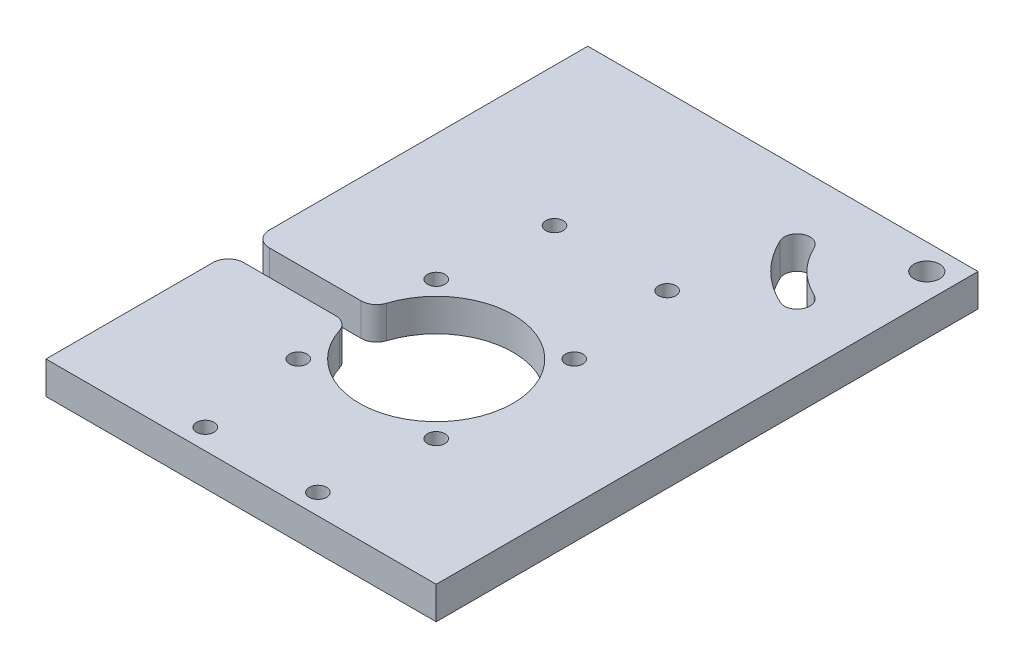
ISO-10303-21;
HEADER;
FILE_DESCRIPTION(('STEP AP214'),'2;1');
FILE_NAME('part.step','',(''),(''),'','','');
FILE_SCHEMA(('AUTOMOTIVE_DESIGN { 1 0 10303 214 1 1 1 1 }'));
ENDSEC;
DATA;
#1=APPLICATION_CONTEXT('core data for automotive mechanical design processes');
#2=APPLICATION_PROTOCOL_DEFINITION('international standard','automotive_design',2000,#1);
#3=PRODUCT_CONTEXT('',#1,'mechanical');
#4=PRODUCT('Part','Part','',(#3));
#5=PRODUCT_RELATED_PRODUCT_CATEGORY('part','',(#4));
#6=PRODUCT_DEFINITION_FORMATION('','',#4);
#7=PRODUCT_DEFINITION_CONTEXT('part definition',#1,'design');
#8=PRODUCT_DEFINITION('design','',#6,#7);
#9=PRODUCT_DEFINITION_SHAPE('','',#8);
#10=(LENGTH_UNIT() NAMED_UNIT(*) SI_UNIT(.MILLI.,.METRE.));
#11=(NAMED_UNIT(*) PLANE_ANGLE_UNIT() SI_UNIT($,.RADIAN.));
#12=(NAMED_UNIT(*) SI_UNIT($,.STERADIAN.) SOLID_ANGLE_UNIT());
#13=UNCERTAINTY_MEASURE_WITH_UNIT(LENGTH_MEASURE(1.E-05),#10,'distance_accuracy_value','');
#14=(GEOMETRIC_REPRESENTATION_CONTEXT(3) GLOBAL_UNCERTAINTY_ASSIGNED_CONTEXT((#13)) GLOBAL_UNIT_ASSIGNED_CONTEXT((#10,
#11,#12)) REPRESENTATION_CONTEXT('',''));
#15=CARTESIAN_POINT('',(0.,0.,0.));
#16=DIRECTION('',(0.,0.,1.));
#17=DIRECTION('',(1.,0.,0.));
#18=AXIS2_PLACEMENT_3D('',#15,#16,#17);
#19=CARTESIAN_POINT('',(0.,6.35,0.));
#20=DIRECTION('',(0.,-1.,0.));
#21=DIRECTION('',(0.,0.,-1.));
#22=AXIS2_PLACEMENT_3D('',#19,#20,#21);
#23=PLANE('',#22);
#24=CARTESIAN_POINT('',(-11.,6.35,34.1));
#25=DIRECTION('',(0.,1.,0.));
#26=DIRECTION('',(0.,0.,1.));
#27=AXIS2_PLACEMENT_3D('',#24,#25,#26);
#28=CIRCLE('',#27,1.69999999999999);
#29=CARTESIAN_POINT('',(-11.,6.35,35.8));
#30=VERTEX_POINT('',#29);
#31=EDGE_CURVE('E617',#30,#30,#28,.T.);
#32=ORIENTED_EDGE('',*,*,#31,.F.);
#33=EDGE_LOOP('',(#32));
#34=FACE_BOUND('',#33,.T.);
#35=CARTESIAN_POINT('',(11.,6.35,34.1));
#36=DIRECTION('',(0.,1.,0.));
#37=DIRECTION('',(0.,0.,1.));
#38=AXIS2_PLACEMENT_3D('',#35,#36,#37);
#39=CIRCLE('',#38,1.69999999999999);
#40=CARTESIAN_POINT('',(11.,6.35,35.8));
#41=VERTEX_POINT('',#40);
#42=EDGE_CURVE('E608',#41,#41,#39,.T.);
#43=ORIENTED_EDGE('',*,*,#42,.F.);
#44=EDGE_LOOP('',(#43));
#45=FACE_BOUND('',#44,.T.);
#46=CARTESIAN_POINT('',(-11.,6.35,-34.1));
#47=DIRECTION('',(0.,1.,0.));
#48=DIRECTION('',(0.,0.,1.));
#49=AXIS2_PLACEMENT_3D('',#46,#47,#48);
#50=CIRCLE('',#49,1.69999999999999);
#51=CARTESIAN_POINT('',(-11.,6.35,-32.4));
#52=VERTEX_POINT('',#51);
#53=EDGE_CURVE('E614',#52,#52,#50,.T.);
#54=ORIENTED_EDGE('',*,*,#53,.F.);
#55=EDGE_LOOP('',(#54));
#56=FACE_BOUND('',#55,.T.);
#57=CARTESIAN_POINT('',(11.,6.35,-34.1));
#58=DIRECTION('',(0.,1.,0.));
#59=DIRECTION('',(0.,0.,1.));
#60=AXIS2_PLACEMENT_3D('',#57,#58,#59);
#61=CIRCLE('',#60,1.69999999999999);
#62=CARTESIAN_POINT('',(11.,6.35,-32.4));
#63=VERTEX_POINT('',#62);
#64=EDGE_CURVE('E627',#63,#63,#61,.T.);
#65=ORIENTED_EDGE('',*,*,#64,.F.);
#66=EDGE_LOOP('',(#65));
#67=FACE_BOUND('',#66,.T.);
#68=CARTESIAN_POINT('',(-13.4703841816038,6.35,-13.4703841816037));
#69=DIRECTION('',(0.,1.,0.));
#70=DIRECTION('',(0.,0.,1.));
#71=AXIS2_PLACEMENT_3D('',#68,#69,#70);
#72=CIRCLE('',#71,1.69999999999999);
#73=CARTESIAN_POINT('',(-13.4703841816038,6.35,-11.7703841816037));
#74=VERTEX_POINT('',#73);
#75=EDGE_CURVE('E647',#74,#74,#72,.T.);
#76=ORIENTED_EDGE('',*,*,#75,.F.);
#77=EDGE_LOOP('',(#76));
#78=FACE_BOUND('',#77,.T.);
#79=CARTESIAN_POINT('',(13.4703841816037,6.35,-13.4703841816038));
#80=DIRECTION('',(0.,1.,0.));
#81=DIRECTION('',(0.,0.,1.));
#82=AXIS2_PLACEMENT_3D('',#79,#80,#81);
#83=CIRCLE('',#82,1.69999999999999);
#84=CARTESIAN_POINT('',(13.4703841816037,6.35,-11.7703841816038));
#85=VERTEX_POINT('',#84);
#86=EDGE_CURVE('E654',#85,#85,#83,.T.);
#87=ORIENTED_EDGE('',*,*,#86,.F.);
#88=EDGE_LOOP('',(#87));
#89=FACE_BOUND('',#88,.T.);
#90=DIRECTION('',(-1.,0.,0.));
#91=VECTOR('',#90,1.);
#92=CARTESIAN_POINT('',(-14.790199457749,6.35,2.5));
#93=LINE('',#92,#91);
#94=CARTESIAN_POINT('',(-17.1391365010026,6.35,2.5));
#95=VERTEX_POINT('',#94);
#96=CARTESIAN_POINT('',(-35.1,6.35,2.5));
#97=VERTEX_POINT('',#96);
#98=EDGE_CURVE('E206',#95,#97,#93,.T.);
#99=ORIENTED_EDGE('',*,*,#98,.T.);
#100=CARTESIAN_POINT('',(-35.1,6.35,5.5));
#101=DIRECTION('',(0.,-1.,0.));
#102=DIRECTION('',(0.,0.,-1.));
#103=AXIS2_PLACEMENT_3D('',#100,#101,#102);
#104=CIRCLE('',#103,3.);
#105=CARTESIAN_POINT('',(-38.1,6.35,5.5));
#106=VERTEX_POINT('',#105);
#107=EDGE_CURVE('E283',#97,#106,#104,.F.);
#108=ORIENTED_EDGE('',*,*,#107,.T.);
#109=DIRECTION('',(0.,0.,1.));
#110=VECTOR('',#109,1.);
#111=CARTESIAN_POINT('',(-38.1,6.35,2.5));
#112=LINE('',#111,#110);
#113=CARTESIAN_POINT('',(-38.1,6.35,38.1));
#114=VERTEX_POINT('',#113);
#115=EDGE_CURVE('E219',#106,#114,#112,.T.);
#116=ORIENTED_EDGE('',*,*,#115,.T.);
#117=DIRECTION('',(1.,0.,0.));
#118=VECTOR('',#117,1.);
#119=CARTESIAN_POINT('',(-38.1,6.35,38.1));
#120=LINE('',#119,#118);
#121=CARTESIAN_POINT('',(38.1,6.35,38.1));
#122=VERTEX_POINT('',#121);
#123=EDGE_CURVE('E215',#114,#122,#120,.T.);
#124=ORIENTED_EDGE('',*,*,#123,.T.);
#125=DIRECTION('',(0.,0.,-1.));
#126=VECTOR('',#125,1.);
#127=CARTESIAN_POINT('',(38.1,6.35,-67.7));
#128=LINE('',#127,#126);
#129=CARTESIAN_POINT('',(38.1,6.35,-67.7));
#130=VERTEX_POINT('',#129);
#131=EDGE_CURVE('E218',#122,#130,#128,.T.);
#132=ORIENTED_EDGE('',*,*,#131,.T.);
#133=DIRECTION('',(-1.,0.,0.));
#134=VECTOR('',#133,1.);
#135=CARTESIAN_POINT('',(-38.1,6.35,-67.7));
#136=LINE('',#135,#134);
#137=CARTESIAN_POINT('',(-38.1,6.35,-67.7));
#138=VERTEX_POINT('',#137);
#139=EDGE_CURVE('E223',#130,#138,#136,.T.);
#140=ORIENTED_EDGE('',*,*,#139,.T.);
#141=DIRECTION('',(0.,0.,1.));
#142=VECTOR('',#141,1.);
#143=CARTESIAN_POINT('',(-38.1,6.35,-67.7));
#144=LINE('',#143,#142);
#145=CARTESIAN_POINT('',(-38.1,6.35,-5.50000000000001));
#146=VERTEX_POINT('',#145);
#147=EDGE_CURVE('E225',#138,#146,#144,.T.);
#148=ORIENTED_EDGE('',*,*,#147,.T.);
#149=CARTESIAN_POINT('',(-35.1,6.35,-5.5));
#150=DIRECTION('',(0.,-1.,0.));
#151=DIRECTION('',(0.,0.,-1.));
#152=AXIS2_PLACEMENT_3D('',#149,#150,#151);
#153=CIRCLE('',#152,3.);
#154=CARTESIAN_POINT('',(-35.1,6.35,-2.5));
#155=VERTEX_POINT('',#154);
#156=EDGE_CURVE('E63',#146,#155,#153,.F.);
#157=ORIENTED_EDGE('',*,*,#156,.T.);
#158=DIRECTION('',(1.,0.,0.));
#159=VECTOR('',#158,1.);
#160=CARTESIAN_POINT('',(-38.1,6.35,-2.5));
#161=LINE('',#160,#159);
#162=CARTESIAN_POINT('',(-17.1391365010026,6.35,-2.5));
#163=VERTEX_POINT('',#162);
#164=EDGE_CURVE('E226',#155,#163,#161,.T.);
#165=ORIENTED_EDGE('',*,*,#164,.T.);
#166=CARTESIAN_POINT('',(-17.1391365010026,6.35,-5.5));
#167=DIRECTION('',(0.,-1.,0.));
#168=DIRECTION('',(0.,0.,-1.));
#169=AXIS2_PLACEMENT_3D('',#166,#167,#168);
#170=CIRCLE('',#169,3.);
#171=CARTESIAN_POINT('',(-14.2826137508355,6.35,-4.58333333333333));
#172=VERTEX_POINT('',#171);
#173=EDGE_CURVE('E275',#163,#172,#170,.F.);
#174=ORIENTED_EDGE('',*,*,#173,.T.);
#175=CARTESIAN_POINT('',(0.,6.35,0.));
#176=DIRECTION('',(0.,-1.,0.));
#177=DIRECTION('',(0.,0.,-1.));
#178=AXIS2_PLACEMENT_3D('',#175,#176,#177);
#179=CIRCLE('',#178,15.);
#180=CARTESIAN_POINT('',(-14.2826137508355,6.35,4.58333333333333));
#181=VERTEX_POINT('',#180);
#182=EDGE_CURVE('E201',#172,#181,#179,.T.);
#183=ORIENTED_EDGE('',*,*,#182,.T.);
#184=CARTESIAN_POINT('',(-17.1391365010026,6.35,5.5));
#185=DIRECTION('',(0.,-1.,0.));
#186=DIRECTION('',(0.,0.,-1.));
#187=AXIS2_PLACEMENT_3D('',#184,#185,#186);
#188=CIRCLE('',#187,3.);
#189=EDGE_CURVE('E278',#181,#95,#188,.F.);
#190=ORIENTED_EDGE('',*,*,#189,.T.);
#191=EDGE_LOOP('',(#99,#108,#116,#124,#132,#140,#148,#157,#165,#174,#183,#190));
#192=FACE_BOUND('',#191,.T.);
#193=CARTESIAN_POINT('',(25.0491221138397,6.35,-45.4348366569518));
#194=DIRECTION('',(0.,1.,0.));
#195=DIRECTION('',(0.,0.,1.));
#196=AXIS2_PLACEMENT_3D('',#193,#194,#195);
#197=CIRCLE('',#196,2.5);
#198=CARTESIAN_POINT('',(23.992576459488,6.35,-43.1690671893602));
#199=VERTEX_POINT('',#198);
#200=CARTESIAN_POINT('',(26.1056677681915,6.35,-47.7006061245434));
#201=VERTEX_POINT('',#200);
#202=EDGE_CURVE('E156',#199,#201,#197,.T.);
#203=ORIENTED_EDGE('',*,*,#202,.F.);
#204=CARTESIAN_POINT('',(33.1,6.35,-62.7));
#205=DIRECTION('',(0.,1.,0.));
#206=DIRECTION('',(0.,0.,-1.));
#207=AXIS2_PLACEMENT_3D('',#204,#205,#206);
#208=CIRCLE('',#207,21.55);
#209=CARTESIAN_POINT('',(13.5690671893602,6.35,-53.5925764594879));
#210=VERTEX_POINT('',#209);
#211=EDGE_CURVE('E183',#210,#199,#208,.T.);
#212=ORIENTED_EDGE('',*,*,#211,.F.);
#213=CARTESIAN_POINT('',(15.8348366569518,6.35,-54.6491221138396));
#214=DIRECTION('',(0.,1.,0.));
#215=DIRECTION('',(0.,0.,1.));
#216=AXIS2_PLACEMENT_3D('',#213,#214,#215);
#217=CIRCLE('',#216,2.5);
#218=CARTESIAN_POINT('',(18.1006061245434,6.35,-55.7056677681914));
#219=VERTEX_POINT('',#218);
#220=EDGE_CURVE('E181',#219,#210,#217,.T.);
#221=ORIENTED_EDGE('',*,*,#220,.F.);
#222=CARTESIAN_POINT('',(33.1,6.35,-62.7));
#223=DIRECTION('',(0.,-1.,0.));
#224=DIRECTION('',(0.,0.,-1.));
#225=AXIS2_PLACEMENT_3D('',#222,#223,#224);
#226=CIRCLE('',#225,16.55);
#227=EDGE_CURVE('E167',#201,#219,#226,.T.);
#228=ORIENTED_EDGE('',*,*,#227,.F.);
#229=EDGE_LOOP('',(#203,#212,#221,#228));
#230=FACE_BOUND('',#229,.T.);
#231=CARTESIAN_POINT('',(33.1,6.35,-62.7));
#232=DIRECTION('',(0.,1.,0.));
#233=DIRECTION('',(0.,0.,1.));
#234=AXIS2_PLACEMENT_3D('',#231,#232,#233);
#235=CIRCLE('',#234,2.5);
#236=CARTESIAN_POINT('',(33.1,6.35,-60.2));
#237=VERTEX_POINT('',#236);
#238=EDGE_CURVE('E190',#237,#237,#235,.T.);
#239=ORIENTED_EDGE('',*,*,#238,.F.);
#240=EDGE_LOOP('',(#239));
#241=FACE_BOUND('',#240,.T.);
#242=CARTESIAN_POINT('',(-13.4703841816037,6.35,13.4703841816038));
#243=DIRECTION('',(0.,1.,0.));
#244=DIRECTION('',(0.,0.,1.));
#245=AXIS2_PLACEMENT_3D('',#242,#243,#244);
#246=CIRCLE('',#245,1.69999999999999);
#247=CARTESIAN_POINT('',(-13.4703841816037,6.35,15.1703841816037));
#248=VERTEX_POINT('',#247);
#249=EDGE_CURVE('E641',#248,#248,#246,.T.);
#250=ORIENTED_EDGE('',*,*,#249,.F.);
#251=EDGE_LOOP('',(#250));
#252=FACE_BOUND('',#251,.T.);
#253=CARTESIAN_POINT('',(13.4703841816039,6.35,13.4703841816036));
#254=DIRECTION('',(0.,1.,0.));
#255=DIRECTION('',(0.,0.,1.));
#256=AXIS2_PLACEMENT_3D('',#253,#254,#255);
#257=CIRCLE('',#256,1.69999999999999);
#258=CARTESIAN_POINT('',(13.4703841816039,6.35,15.1703841816036));
#259=VERTEX_POINT('',#258);
#260=EDGE_CURVE('E634',#259,#259,#257,.T.);
#261=ORIENTED_EDGE('',*,*,#260,.F.);
#262=EDGE_LOOP('',(#261));
#263=FACE_BOUND('',#262,.T.);
#264=ADVANCED_FACE('F41',(#34,#45,#56,#67,#78,#89,#192,#230,#241,#252,#263),#23,.F.);
#265=CARTESIAN_POINT('',(0.,0.,0.));
#266=DIRECTION('',(0.,-1.,0.));
#267=DIRECTION('',(0.,0.,-1.));
#268=AXIS2_PLACEMENT_3D('',#265,#266,#267);
#269=PLANE('',#268);
#270=CARTESIAN_POINT('',(-11.,0.,34.1));
#271=DIRECTION('',(0.,1.,0.));
#272=DIRECTION('',(0.,0.,1.));
#273=AXIS2_PLACEMENT_3D('',#270,#271,#272);
#274=CIRCLE('',#273,1.7);
#275=CARTESIAN_POINT('',(-11.,0.,35.8));
#276=VERTEX_POINT('',#275);
#277=EDGE_CURVE('E610',#276,#276,#274,.T.);
#278=ORIENTED_EDGE('',*,*,#277,.T.);
#279=EDGE_LOOP('',(#278));
#280=FACE_BOUND('',#279,.T.);
#281=CARTESIAN_POINT('',(11.,0.,34.1));
#282=DIRECTION('',(0.,1.,0.));
#283=DIRECTION('',(0.,0.,1.));
#284=AXIS2_PLACEMENT_3D('',#281,#282,#283);
#285=CIRCLE('',#284,1.7);
#286=CARTESIAN_POINT('',(11.,0.,35.8));
#287=VERTEX_POINT('',#286);
#288=EDGE_CURVE('E605',#287,#287,#285,.T.);
#289=ORIENTED_EDGE('',*,*,#288,.T.);
#290=EDGE_LOOP('',(#289));
#291=FACE_BOUND('',#290,.T.);
#292=CARTESIAN_POINT('',(-11.,0.,-34.1));
#293=DIRECTION('',(0.,1.,0.));
#294=DIRECTION('',(0.,0.,1.));
#295=AXIS2_PLACEMENT_3D('',#292,#293,#294);
#296=CIRCLE('',#295,1.7);
#297=CARTESIAN_POINT('',(-11.,0.,-32.4));
#298=VERTEX_POINT('',#297);
#299=EDGE_CURVE('E624',#298,#298,#296,.T.);
#300=ORIENTED_EDGE('',*,*,#299,.T.);
#301=EDGE_LOOP('',(#300));
#302=FACE_BOUND('',#301,.T.);
#303=CARTESIAN_POINT('',(11.,0.,-34.1));
#304=DIRECTION('',(0.,1.,0.));
#305=DIRECTION('',(0.,0.,1.));
#306=AXIS2_PLACEMENT_3D('',#303,#304,#305);
#307=CIRCLE('',#306,1.7);
#308=CARTESIAN_POINT('',(11.,0.,-32.4));
#309=VERTEX_POINT('',#308);
#310=EDGE_CURVE('E631',#309,#309,#307,.T.);
#311=ORIENTED_EDGE('',*,*,#310,.T.);
#312=EDGE_LOOP('',(#311));
#313=FACE_BOUND('',#312,.T.);
#314=CARTESIAN_POINT('',(13.4703841816039,0.,13.4703841816036));
#315=DIRECTION('',(0.,1.,0.));
#316=DIRECTION('',(0.,0.,1.));
#317=AXIS2_PLACEMENT_3D('',#314,#315,#316);
#318=CIRCLE('',#317,1.7);
#319=CARTESIAN_POINT('',(13.4703841816039,0.,15.1703841816036));
#320=VERTEX_POINT('',#319);
#321=EDGE_CURVE('E638',#320,#320,#318,.T.);
#322=ORIENTED_EDGE('',*,*,#321,.T.);
#323=EDGE_LOOP('',(#322));
#324=FACE_BOUND('',#323,.T.);
#325=CARTESIAN_POINT('',(33.1,0.,-62.7));
#326=DIRECTION('',(0.,1.,0.));
#327=DIRECTION('',(0.,0.,1.));
#328=AXIS2_PLACEMENT_3D('',#325,#326,#327);
#329=CIRCLE('',#328,2.5);
#330=CARTESIAN_POINT('',(33.1,0.,-60.2));
#331=VERTEX_POINT('',#330);
#332=EDGE_CURVE('E661',#331,#331,#329,.T.);
#333=ORIENTED_EDGE('',*,*,#332,.T.);
#334=EDGE_LOOP('',(#333));
#335=FACE_BOUND('',#334,.T.);
#336=DIRECTION('',(0.,0.,1.));
#337=VECTOR('',#336,1.);
#338=CARTESIAN_POINT('',(-38.1,0.,2.5));
#339=LINE('',#338,#337);
#340=CARTESIAN_POINT('',(-38.1,0.,5.5));
#341=VERTEX_POINT('',#340);
#342=CARTESIAN_POINT('',(-38.1,0.,38.1));
#343=VERTEX_POINT('',#342);
#344=EDGE_CURVE('E236',#341,#343,#339,.T.);
#345=ORIENTED_EDGE('',*,*,#344,.F.);
#346=CARTESIAN_POINT('',(-35.1,0.,5.5));
#347=DIRECTION('',(0.,-1.,0.));
#348=DIRECTION('',(0.,0.,-1.));
#349=AXIS2_PLACEMENT_3D('',#346,#347,#348);
#350=CIRCLE('',#349,3.);
#351=CARTESIAN_POINT('',(-35.1,0.,2.5));
#352=VERTEX_POINT('',#351);
#353=EDGE_CURVE('E268',#341,#352,#350,.T.);
#354=ORIENTED_EDGE('',*,*,#353,.T.);
#355=DIRECTION('',(-1.,0.,0.));
#356=VECTOR('',#355,1.);
#357=CARTESIAN_POINT('',(-14.790199457749,0.,2.5));
#358=LINE('',#357,#356);
#359=CARTESIAN_POINT('',(-17.1391365010026,0.,2.5));
#360=VERTEX_POINT('',#359);
#361=EDGE_CURVE('E233',#360,#352,#358,.T.);
#362=ORIENTED_EDGE('',*,*,#361,.F.);
#363=CARTESIAN_POINT('',(-17.1391365010026,0.,5.5));
#364=DIRECTION('',(0.,-1.,0.));
#365=DIRECTION('',(0.,0.,-1.));
#366=AXIS2_PLACEMENT_3D('',#363,#364,#365);
#367=CIRCLE('',#366,3.);
#368=CARTESIAN_POINT('',(-14.2826137508355,0.,4.58333333333333));
#369=VERTEX_POINT('',#368);
#370=EDGE_CURVE('E264',#360,#369,#367,.T.);
#371=ORIENTED_EDGE('',*,*,#370,.T.);
#372=CARTESIAN_POINT('',(0.,0.,0.));
#373=DIRECTION('',(0.,-1.,0.));
#374=DIRECTION('',(0.,0.,-1.));
#375=AXIS2_PLACEMENT_3D('',#372,#373,#374);
#376=CIRCLE('',#375,15.);
#377=CARTESIAN_POINT('',(-14.2826137508355,0.,-4.58333333333333));
#378=VERTEX_POINT('',#377);
#379=EDGE_CURVE('E175',#378,#369,#376,.T.);
#380=ORIENTED_EDGE('',*,*,#379,.F.);
#381=CARTESIAN_POINT('',(-17.1391365010026,0.,-5.5));
#382=DIRECTION('',(0.,-1.,0.));
#383=DIRECTION('',(0.,0.,-1.));
#384=AXIS2_PLACEMENT_3D('',#381,#382,#383);
#385=CIRCLE('',#384,3.);
#386=CARTESIAN_POINT('',(-17.1391365010026,0.,-2.5));
#387=VERTEX_POINT('',#386);
#388=EDGE_CURVE('E262',#378,#387,#385,.T.);
#389=ORIENTED_EDGE('',*,*,#388,.T.);
#390=DIRECTION('',(1.,0.,0.));
#391=VECTOR('',#390,1.);
#392=CARTESIAN_POINT('',(-38.1,0.,-2.5));
#393=LINE('',#392,#391);
#394=CARTESIAN_POINT('',(-35.1,0.,-2.5));
#395=VERTEX_POINT('',#394);
#396=EDGE_CURVE('E207',#395,#387,#393,.T.);
#397=ORIENTED_EDGE('',*,*,#396,.F.);
#398=CARTESIAN_POINT('',(-35.1,0.,-5.5));
#399=DIRECTION('',(0.,-1.,0.));
#400=DIRECTION('',(0.,0.,-1.));
#401=AXIS2_PLACEMENT_3D('',#398,#399,#400);
#402=CIRCLE('',#401,3.);
#403=CARTESIAN_POINT('',(-38.1,0.,-5.50000000000001));
#404=VERTEX_POINT('',#403);
#405=EDGE_CURVE('E266',#395,#404,#402,.T.);
#406=ORIENTED_EDGE('',*,*,#405,.T.);
#407=DIRECTION('',(0.,0.,1.));
#408=VECTOR('',#407,1.);
#409=CARTESIAN_POINT('',(-38.1,0.,-67.7));
#410=LINE('',#409,#408);
#411=CARTESIAN_POINT('',(-38.1,0.,-67.7));
#412=VERTEX_POINT('',#411);
#413=EDGE_CURVE('E244',#412,#404,#410,.T.);
#414=ORIENTED_EDGE('',*,*,#413,.F.);
#415=DIRECTION('',(-1.,0.,0.));
#416=VECTOR('',#415,1.);
#417=CARTESIAN_POINT('',(-38.1,0.,-67.7));
#418=LINE('',#417,#416);
#419=CARTESIAN_POINT('',(38.1,0.,-67.7));
#420=VERTEX_POINT('',#419);
#421=EDGE_CURVE('E242',#420,#412,#418,.T.);
#422=ORIENTED_EDGE('',*,*,#421,.F.);
#423=DIRECTION('',(0.,0.,-1.));
#424=VECTOR('',#423,1.);
#425=CARTESIAN_POINT('',(38.1,0.,-67.7));
#426=LINE('',#425,#424);
#427=CARTESIAN_POINT('',(38.1,0.,38.1));
#428=VERTEX_POINT('',#427);
#429=EDGE_CURVE('E240',#428,#420,#426,.T.);
#430=ORIENTED_EDGE('',*,*,#429,.F.);
#431=DIRECTION('',(1.,0.,0.));
#432=VECTOR('',#431,1.);
#433=CARTESIAN_POINT('',(-38.1,0.,38.1));
#434=LINE('',#433,#432);
#435=EDGE_CURVE('E238',#343,#428,#434,.T.);
#436=ORIENTED_EDGE('',*,*,#435,.F.);
#437=EDGE_LOOP('',(#345,#354,#362,#371,#380,#389,#397,#406,#414,#422,#430,#436));
#438=FACE_BOUND('',#437,.T.);
#439=CARTESIAN_POINT('',(33.1,0.,-62.7));
#440=DIRECTION('',(0.,1.,0.));
#441=DIRECTION('',(0.,0.,-1.));
#442=AXIS2_PLACEMENT_3D('',#439,#440,#441);
#443=CIRCLE('',#442,21.55);
#444=CARTESIAN_POINT('',(13.5690671893602,0.,-53.5925764594879));
#445=VERTEX_POINT('',#444);
#446=CARTESIAN_POINT('',(23.992576459488,0.,-43.1690671893602));
#447=VERTEX_POINT('',#446);
#448=EDGE_CURVE('E168',#445,#447,#443,.T.);
#449=ORIENTED_EDGE('',*,*,#448,.T.);
#450=CARTESIAN_POINT('',(25.0491221138397,0.,-45.4348366569518));
#451=DIRECTION('',(0.,1.,0.));
#452=DIRECTION('',(0.,0.,1.));
#453=AXIS2_PLACEMENT_3D('',#450,#451,#452);
#454=CIRCLE('',#453,2.5);
#455=CARTESIAN_POINT('',(26.1056677681915,0.,-47.7006061245434));
#456=VERTEX_POINT('',#455);
#457=EDGE_CURVE('E188',#447,#456,#454,.T.);
#458=ORIENTED_EDGE('',*,*,#457,.T.);
#459=CARTESIAN_POINT('',(33.1,0.,-62.7));
#460=DIRECTION('',(0.,-1.,0.));
#461=DIRECTION('',(0.,0.,-1.));
#462=AXIS2_PLACEMENT_3D('',#459,#460,#461);
#463=CIRCLE('',#462,16.55);
#464=CARTESIAN_POINT('',(18.1006061245434,0.,-55.7056677681914));
#465=VERTEX_POINT('',#464);
#466=EDGE_CURVE('E174',#456,#465,#463,.T.);
#467=ORIENTED_EDGE('',*,*,#466,.T.);
#468=CARTESIAN_POINT('',(15.8348366569518,0.,-54.6491221138396));
#469=DIRECTION('',(0.,1.,0.));
#470=DIRECTION('',(0.,0.,1.));
#471=AXIS2_PLACEMENT_3D('',#468,#469,#470);
#472=CIRCLE('',#471,2.5);
#473=EDGE_CURVE('E192',#465,#445,#472,.T.);
#474=ORIENTED_EDGE('',*,*,#473,.T.);
#475=EDGE_LOOP('',(#449,#458,#467,#474));
#476=FACE_BOUND('',#475,.T.);
#477=CARTESIAN_POINT('',(13.4703841816037,0.,-13.4703841816038));
#478=DIRECTION('',(0.,1.,0.));
#479=DIRECTION('',(0.,0.,1.));
#480=AXIS2_PLACEMENT_3D('',#477,#478,#479);
#481=CIRCLE('',#480,1.7);
#482=CARTESIAN_POINT('',(13.4703841816037,0.,-11.7703841816038));
#483=VERTEX_POINT('',#482);
#484=EDGE_CURVE('E658',#483,#483,#481,.T.);
#485=ORIENTED_EDGE('',*,*,#484,.T.);
#486=EDGE_LOOP('',(#485));
#487=FACE_BOUND('',#486,.T.);
#488=CARTESIAN_POINT('',(-13.4703841816038,0.,-13.4703841816037));
#489=DIRECTION('',(0.,1.,0.));
#490=DIRECTION('',(0.,0.,1.));
#491=AXIS2_PLACEMENT_3D('',#488,#489,#490);
#492=CIRCLE('',#491,1.7);
#493=CARTESIAN_POINT('',(-13.4703841816038,0.,-11.7703841816037));
#494=VERTEX_POINT('',#493);
#495=EDGE_CURVE('E651',#494,#494,#492,.T.);
#496=ORIENTED_EDGE('',*,*,#495,.T.);
#497=EDGE_LOOP('',(#496));
#498=FACE_BOUND('',#497,.T.);
#499=CARTESIAN_POINT('',(-13.4703841816037,0.,13.4703841816038));
#500=DIRECTION('',(0.,1.,0.));
#501=DIRECTION('',(0.,0.,1.));
#502=AXIS2_PLACEMENT_3D('',#499,#500,#501);
#503=CIRCLE('',#502,1.7);
#504=CARTESIAN_POINT('',(-13.4703841816037,0.,15.1703841816038));
#505=VERTEX_POINT('',#504);
#506=EDGE_CURVE('E644',#505,#505,#503,.T.);
#507=ORIENTED_EDGE('',*,*,#506,.T.);
#508=EDGE_LOOP('',(#507));
#509=FACE_BOUND('',#508,.T.);
#510=ADVANCED_FACE('F302',(#280,#291,#302,#313,#324,#335,#438,#476,#487,#498,#509),#269,.T.);
#511=CARTESIAN_POINT('',(0.,6.35,0.));
#512=DIRECTION('',(0.,-1.,0.));
#513=DIRECTION('',(0.,0.,-1.));
#514=AXIS2_PLACEMENT_3D('',#511,#512,#513);
#515=CYLINDRICAL_SURFACE('',#514,15.);
#516=ORIENTED_EDGE('',*,*,#379,.T.);
#517=DIRECTION('',(0.,-1.,0.));
#518=VECTOR('',#517,1.);
#519=CARTESIAN_POINT('',(-14.2826137508355,6.35,4.58333333333333));
#520=LINE('',#519,#518);
#521=EDGE_CURVE('E12',#369,#181,#520,.F.);
#522=ORIENTED_EDGE('',*,*,#521,.T.);
#523=ORIENTED_EDGE('',*,*,#182,.F.);
#524=DIRECTION('',(0.,-1.,0.));
#525=VECTOR('',#524,1.);
#526=CARTESIAN_POINT('',(-14.2826137508355,6.35,-4.58333333333333));
#527=LINE('',#526,#525);
#528=EDGE_CURVE('E49',#172,#378,#527,.T.);
#529=ORIENTED_EDGE('',*,*,#528,.T.);
#530=EDGE_LOOP('',(#516,#522,#523,#529));
#531=FACE_BOUND('',#530,.T.);
#532=ADVANCED_FACE('F296',(#531),#515,.F.);
#533=CARTESIAN_POINT('',(-14.790199457749,6.35,2.5));
#534=DIRECTION('',(0.,0.,1.));
#535=DIRECTION('',(1.,0.,0.));
#536=AXIS2_PLACEMENT_3D('',#533,#534,#535);
#537=PLANE('',#536);
#538=ORIENTED_EDGE('',*,*,#361,.T.);
#539=DIRECTION('',(0.,-1.,0.));
#540=VECTOR('',#539,1.);
#541=CARTESIAN_POINT('',(-35.1,6.35,2.5));
#542=LINE('',#541,#540);
#543=EDGE_CURVE('E273',#352,#97,#542,.F.);
#544=ORIENTED_EDGE('',*,*,#543,.T.);
#545=ORIENTED_EDGE('',*,*,#98,.F.);
#546=DIRECTION('',(0.,-1.,0.));
#547=VECTOR('',#546,1.);
#548=CARTESIAN_POINT('',(-17.1391365010026,6.35,2.5));
#549=LINE('',#548,#547);
#550=EDGE_CURVE('E270',#95,#360,#549,.T.);
#551=ORIENTED_EDGE('',*,*,#550,.T.);
#552=EDGE_LOOP('',(#538,#544,#545,#551));
#553=FACE_BOUND('',#552,.T.);
#554=ADVANCED_FACE('F312',(#553),#537,.F.);
#555=CARTESIAN_POINT('',(-38.1,6.35,2.5));
#556=DIRECTION('',(1.,0.,0.));
#557=DIRECTION('',(0.,0.,-1.));
#558=AXIS2_PLACEMENT_3D('',#555,#556,#557);
#559=PLANE('',#558);
#560=ORIENTED_EDGE('',*,*,#115,.F.);
#561=DIRECTION('',(0.,-1.,0.));
#562=VECTOR('',#561,1.);
#563=CARTESIAN_POINT('',(-38.1,6.35,5.5));
#564=LINE('',#563,#562);
#565=EDGE_CURVE('E259',#106,#341,#564,.T.);
#566=ORIENTED_EDGE('',*,*,#565,.T.);
#567=ORIENTED_EDGE('',*,*,#344,.T.);
#568=DIRECTION('',(0.,-1.,0.));
#569=VECTOR('',#568,1.);
#570=CARTESIAN_POINT('',(-38.1,6.35,38.1));
#571=LINE('',#570,#569);
#572=EDGE_CURVE('E256',#114,#343,#571,.T.);
#573=ORIENTED_EDGE('',*,*,#572,.F.);
#574=EDGE_LOOP('',(#560,#566,#567,#573));
#575=FACE_BOUND('',#574,.T.);
#576=ADVANCED_FACE('F323',(#575),#559,.F.);
#577=CARTESIAN_POINT('',(-38.1,6.35,38.1));
#578=DIRECTION('',(0.,0.,-1.));
#579=DIRECTION('',(-1.,0.,0.));
#580=AXIS2_PLACEMENT_3D('',#577,#578,#579);
#581=PLANE('',#580);
#582=ORIENTED_EDGE('',*,*,#435,.T.);
#583=DIRECTION('',(0.,-1.,0.));
#584=VECTOR('',#583,1.);
#585=CARTESIAN_POINT('',(38.1,6.35,38.1));
#586=LINE('',#585,#584);
#587=EDGE_CURVE('E253',#122,#428,#586,.T.);
#588=ORIENTED_EDGE('',*,*,#587,.F.);
#589=ORIENTED_EDGE('',*,*,#123,.F.);
#590=ORIENTED_EDGE('',*,*,#572,.T.);
#591=EDGE_LOOP('',(#582,#588,#589,#590));
#592=FACE_BOUND('',#591,.T.);
#593=ADVANCED_FACE('F326',(#592),#581,.F.);
#594=CARTESIAN_POINT('',(38.1,6.35,-67.7));
#595=DIRECTION('',(-1.,0.,0.));
#596=DIRECTION('',(0.,0.,1.));
#597=AXIS2_PLACEMENT_3D('',#594,#595,#596);
#598=PLANE('',#597);
#599=ORIENTED_EDGE('',*,*,#429,.T.);
#600=DIRECTION('',(0.,-1.,0.));
#601=VECTOR('',#600,1.);
#602=CARTESIAN_POINT('',(38.1,6.35,-67.7));
#603=LINE('',#602,#601);
#604=EDGE_CURVE('E250',#130,#420,#603,.T.);
#605=ORIENTED_EDGE('',*,*,#604,.F.);
#606=ORIENTED_EDGE('',*,*,#131,.F.);
#607=ORIENTED_EDGE('',*,*,#587,.T.);
#608=EDGE_LOOP('',(#599,#605,#606,#607));
#609=FACE_BOUND('',#608,.T.);
#610=ADVANCED_FACE('F331',(#609),#598,.F.);
#611=CARTESIAN_POINT('',(-38.1,6.35,-67.7));
#612=DIRECTION('',(0.,0.,1.));
#613=DIRECTION('',(1.,0.,0.));
#614=AXIS2_PLACEMENT_3D('',#611,#612,#613);
#615=PLANE('',#614);
#616=ORIENTED_EDGE('',*,*,#421,.T.);
#617=DIRECTION('',(0.,-1.,0.));
#618=VECTOR('',#617,1.);
#619=CARTESIAN_POINT('',(-38.1,6.35,-67.7));
#620=LINE('',#619,#618);
#621=EDGE_CURVE('E230',#138,#412,#620,.T.);
#622=ORIENTED_EDGE('',*,*,#621,.F.);
#623=ORIENTED_EDGE('',*,*,#139,.F.);
#624=ORIENTED_EDGE('',*,*,#604,.T.);
#625=EDGE_LOOP('',(#616,#622,#623,#624));
#626=FACE_BOUND('',#625,.T.);
#627=ADVANCED_FACE('F336',(#626),#615,.F.);
#628=CARTESIAN_POINT('',(-38.1,6.35,-67.7));
#629=DIRECTION('',(1.,0.,0.));
#630=DIRECTION('',(0.,0.,-1.));
#631=AXIS2_PLACEMENT_3D('',#628,#629,#630);
#632=PLANE('',#631);
#633=ORIENTED_EDGE('',*,*,#413,.T.);
#634=DIRECTION('',(0.,-1.,0.));
#635=VECTOR('',#634,1.);
#636=CARTESIAN_POINT('',(-38.1,6.35,-5.50000000000001));
#637=LINE('',#636,#635);
#638=EDGE_CURVE('E290',#404,#146,#637,.F.);
#639=ORIENTED_EDGE('',*,*,#638,.T.);
#640=ORIENTED_EDGE('',*,*,#147,.F.);
#641=ORIENTED_EDGE('',*,*,#621,.T.);
#642=EDGE_LOOP('',(#633,#639,#640,#641));
#643=FACE_BOUND('',#642,.T.);
#644=ADVANCED_FACE('F340',(#643),#632,.F.);
#645=CARTESIAN_POINT('',(-38.1,6.35,-2.5));
#646=DIRECTION('',(0.,0.,-1.));
#647=DIRECTION('',(-1.,0.,0.));
#648=AXIS2_PLACEMENT_3D('',#645,#646,#647);
#649=PLANE('',#648);
#650=ORIENTED_EDGE('',*,*,#164,.F.);
#651=DIRECTION('',(0.,-1.,0.));
#652=VECTOR('',#651,1.);
#653=CARTESIAN_POINT('',(-35.1,6.35,-2.5));
#654=LINE('',#653,#652);
#655=EDGE_CURVE('E287',#155,#395,#654,.T.);
#656=ORIENTED_EDGE('',*,*,#655,.T.);
#657=ORIENTED_EDGE('',*,*,#396,.T.);
#658=DIRECTION('',(0.,-1.,0.));
#659=VECTOR('',#658,1.);
#660=CARTESIAN_POINT('',(-17.1391365010026,6.35,-2.5));
#661=LINE('',#660,#659);
#662=EDGE_CURVE('E56',#387,#163,#661,.F.);
#663=ORIENTED_EDGE('',*,*,#662,.T.);
#664=EDGE_LOOP('',(#650,#656,#657,#663));
#665=FACE_BOUND('',#664,.T.);
#666=ADVANCED_FACE('F345',(#665),#649,.F.);
#667=CARTESIAN_POINT('',(25.0491221138397,6.35,-45.4348366569518));
#668=DIRECTION('',(0.,-1.,0.));
#669=DIRECTION('',(0.,0.,-1.));
#670=AXIS2_PLACEMENT_3D('',#667,#668,#669);
#671=CYLINDRICAL_SURFACE('',#670,2.5);
#672=ORIENTED_EDGE('',*,*,#457,.F.);
#673=DIRECTION('',(0.,-1.,0.));
#674=VECTOR('',#673,1.);
#675=CARTESIAN_POINT('',(23.992576459488,6.35,-43.1690671893602));
#676=LINE('',#675,#674);
#677=EDGE_CURVE('E162',#199,#447,#676,.T.);
#678=ORIENTED_EDGE('',*,*,#677,.F.);
#679=ORIENTED_EDGE('',*,*,#202,.T.);
#680=DIRECTION('',(0.,-1.,0.));
#681=VECTOR('',#680,1.);
#682=CARTESIAN_POINT('',(26.1056677681915,6.35,-47.7006061245434));
#683=LINE('',#682,#681);
#684=EDGE_CURVE('E159',#201,#456,#683,.T.);
#685=ORIENTED_EDGE('',*,*,#684,.T.);
#686=EDGE_LOOP('',(#672,#678,#679,#685));
#687=FACE_BOUND('',#686,.T.);
#688=ADVANCED_FACE('F158',(#687),#671,.F.);
#689=CARTESIAN_POINT('',(33.1,6.35,-62.7));
#690=DIRECTION('',(0.,-1.,0.));
#691=DIRECTION('',(0.,0.,-1.));
#692=AXIS2_PLACEMENT_3D('',#689,#690,#691);
#693=CYLINDRICAL_SURFACE('',#692,16.55);
#694=ORIENTED_EDGE('',*,*,#466,.F.);
#695=ORIENTED_EDGE('',*,*,#684,.F.);
#696=ORIENTED_EDGE('',*,*,#227,.T.);
#697=DIRECTION('',(0.,-1.,0.));
#698=VECTOR('',#697,1.);
#699=CARTESIAN_POINT('',(18.1006061245434,6.35,-55.7056677681914));
#700=LINE('',#699,#698);
#701=EDGE_CURVE('E176',#219,#465,#700,.T.);
#702=ORIENTED_EDGE('',*,*,#701,.T.);
#703=EDGE_LOOP('',(#694,#695,#696,#702));
#704=FACE_BOUND('',#703,.T.);
#705=ADVANCED_FACE('F171',(#704),#693,.T.);
#706=CARTESIAN_POINT('',(15.8348366569518,6.35,-54.6491221138396));
#707=DIRECTION('',(0.,-1.,0.));
#708=DIRECTION('',(0.,0.,-1.));
#709=AXIS2_PLACEMENT_3D('',#706,#707,#708);
#710=CYLINDRICAL_SURFACE('',#709,2.5);
#711=ORIENTED_EDGE('',*,*,#473,.F.);
#712=ORIENTED_EDGE('',*,*,#701,.F.);
#713=ORIENTED_EDGE('',*,*,#220,.T.);
#714=DIRECTION('',(0.,-1.,0.));
#715=VECTOR('',#714,1.);
#716=CARTESIAN_POINT('',(13.5690671893602,6.35,-53.5925764594879));
#717=LINE('',#716,#715);
#718=EDGE_CURVE('E198',#210,#445,#717,.T.);
#719=ORIENTED_EDGE('',*,*,#718,.T.);
#720=EDGE_LOOP('',(#711,#712,#713,#719));
#721=FACE_BOUND('',#720,.T.);
#722=ADVANCED_FACE('F429',(#721),#710,.F.);
#723=CARTESIAN_POINT('',(33.1,6.35,-62.7));
#724=DIRECTION('',(0.,-1.,0.));
#725=DIRECTION('',(0.,0.,-1.));
#726=AXIS2_PLACEMENT_3D('',#723,#724,#725);
#727=CYLINDRICAL_SURFACE('',#726,21.55);
#728=ORIENTED_EDGE('',*,*,#448,.F.);
#729=ORIENTED_EDGE('',*,*,#718,.F.);
#730=ORIENTED_EDGE('',*,*,#211,.T.);
#731=ORIENTED_EDGE('',*,*,#677,.T.);
#732=EDGE_LOOP('',(#728,#729,#730,#731));
#733=FACE_BOUND('',#732,.T.);
#734=ADVANCED_FACE('F435',(#733),#727,.F.);
#735=CARTESIAN_POINT('',(33.1,6.35,-62.7));
#736=DIRECTION('',(0.,-1.,0.));
#737=DIRECTION('',(0.,0.,-1.));
#738=AXIS2_PLACEMENT_3D('',#735,#736,#737);
#739=CYLINDRICAL_SURFACE('',#738,2.5);
#740=ORIENTED_EDGE('',*,*,#238,.T.);
#741=EDGE_LOOP('',(#740));
#742=FACE_BOUND('',#741,.T.);
#743=ORIENTED_EDGE('',*,*,#332,.F.);
#744=EDGE_LOOP('',(#743));
#745=FACE_BOUND('',#744,.T.);
#746=ADVANCED_FACE('F441',(#742,#745),#739,.F.);
#747=CARTESIAN_POINT('',(13.4703841816037,6.35,-13.4703841816038));
#748=DIRECTION('',(0.,1.,0.));
#749=DIRECTION('',(0.,0.,1.));
#750=AXIS2_PLACEMENT_3D('',#747,#748,#749);
#751=CYLINDRICAL_SURFACE('',#750,1.69999999999999);
#752=ORIENTED_EDGE('',*,*,#484,.F.);
#753=EDGE_LOOP('',(#752));
#754=FACE_BOUND('',#753,.T.);
#755=ORIENTED_EDGE('',*,*,#86,.T.);
#756=EDGE_LOOP('',(#755));
#757=FACE_BOUND('',#756,.T.);
#758=ADVANCED_FACE('F448',(#754,#757),#751,.F.);
#759=CARTESIAN_POINT('',(-13.4703841816038,6.35,-13.4703841816037));
#760=DIRECTION('',(0.,1.,0.));
#761=DIRECTION('',(0.,0.,1.));
#762=AXIS2_PLACEMENT_3D('',#759,#760,#761);
#763=CYLINDRICAL_SURFACE('',#762,1.69999999999999);
#764=ORIENTED_EDGE('',*,*,#495,.F.);
#765=EDGE_LOOP('',(#764));
#766=FACE_BOUND('',#765,.T.);
#767=ORIENTED_EDGE('',*,*,#75,.T.);
#768=EDGE_LOOP('',(#767));
#769=FACE_BOUND('',#768,.T.);
#770=ADVANCED_FACE('F455',(#766,#769),#763,.F.);
#771=CARTESIAN_POINT('',(-13.4703841816037,6.35,13.4703841816038));
#772=DIRECTION('',(0.,1.,0.));
#773=DIRECTION('',(0.,0.,1.));
#774=AXIS2_PLACEMENT_3D('',#771,#772,#773);
#775=CYLINDRICAL_SURFACE('',#774,1.69999999999999);
#776=ORIENTED_EDGE('',*,*,#506,.F.);
#777=EDGE_LOOP('',(#776));
#778=FACE_BOUND('',#777,.T.);
#779=ORIENTED_EDGE('',*,*,#249,.T.);
#780=EDGE_LOOP('',(#779));
#781=FACE_BOUND('',#780,.T.);
#782=ADVANCED_FACE('F462',(#778,#781),#775,.F.);
#783=CARTESIAN_POINT('',(13.4703841816039,6.35,13.4703841816036));
#784=DIRECTION('',(0.,1.,0.));
#785=DIRECTION('',(0.,0.,1.));
#786=AXIS2_PLACEMENT_3D('',#783,#784,#785);
#787=CYLINDRICAL_SURFACE('',#786,1.69999999999999);
#788=ORIENTED_EDGE('',*,*,#321,.F.);
#789=EDGE_LOOP('',(#788));
#790=FACE_BOUND('',#789,.T.);
#791=ORIENTED_EDGE('',*,*,#260,.T.);
#792=EDGE_LOOP('',(#791));
#793=FACE_BOUND('',#792,.T.);
#794=ADVANCED_FACE('F469',(#790,#793),#787,.F.);
#795=CARTESIAN_POINT('',(11.,6.35,-34.1));
#796=DIRECTION('',(0.,1.,0.));
#797=DIRECTION('',(0.,0.,1.));
#798=AXIS2_PLACEMENT_3D('',#795,#796,#797);
#799=CYLINDRICAL_SURFACE('',#798,1.69999999999999);
#800=ORIENTED_EDGE('',*,*,#310,.F.);
#801=EDGE_LOOP('',(#800));
#802=FACE_BOUND('',#801,.T.);
#803=ORIENTED_EDGE('',*,*,#64,.T.);
#804=EDGE_LOOP('',(#803));
#805=FACE_BOUND('',#804,.T.);
#806=ADVANCED_FACE('F476',(#802,#805),#799,.F.);
#807=CARTESIAN_POINT('',(-11.,6.35,-34.1));
#808=DIRECTION('',(0.,1.,0.));
#809=DIRECTION('',(0.,0.,1.));
#810=AXIS2_PLACEMENT_3D('',#807,#808,#809);
#811=CYLINDRICAL_SURFACE('',#810,1.69999999999999);
#812=ORIENTED_EDGE('',*,*,#299,.F.);
#813=EDGE_LOOP('',(#812));
#814=FACE_BOUND('',#813,.T.);
#815=ORIENTED_EDGE('',*,*,#53,.T.);
#816=EDGE_LOOP('',(#815));
#817=FACE_BOUND('',#816,.T.);
#818=ADVANCED_FACE('F483',(#814,#817),#811,.F.);
#819=CARTESIAN_POINT('',(11.,6.35,34.1));
#820=DIRECTION('',(0.,1.,0.));
#821=DIRECTION('',(0.,0.,1.));
#822=AXIS2_PLACEMENT_3D('',#819,#820,#821);
#823=CYLINDRICAL_SURFACE('',#822,1.69999999999999);
#824=ORIENTED_EDGE('',*,*,#288,.F.);
#825=EDGE_LOOP('',(#824));
#826=FACE_BOUND('',#825,.T.);
#827=ORIENTED_EDGE('',*,*,#42,.T.);
#828=EDGE_LOOP('',(#827));
#829=FACE_BOUND('',#828,.T.);
#830=ADVANCED_FACE('F356',(#826,#829),#823,.F.);
#831=CARTESIAN_POINT('',(-11.,6.35,34.1));
#832=DIRECTION('',(0.,1.,0.));
#833=DIRECTION('',(0.,0.,1.));
#834=AXIS2_PLACEMENT_3D('',#831,#832,#833);
#835=CYLINDRICAL_SURFACE('',#834,1.69999999999999);
#836=ORIENTED_EDGE('',*,*,#277,.F.);
#837=EDGE_LOOP('',(#836));
#838=FACE_BOUND('',#837,.T.);
#839=ORIENTED_EDGE('',*,*,#31,.T.);
#840=EDGE_LOOP('',(#839));
#841=FACE_BOUND('',#840,.T.);
#842=ADVANCED_FACE('F349',(#838,#841),#835,.F.);
#843=CARTESIAN_POINT('',(-35.1,6.35,5.5));
#844=DIRECTION('',(0.,-1.,0.));
#845=DIRECTION('',(0.,0.,-1.));
#846=AXIS2_PLACEMENT_3D('',#843,#844,#845);
#847=CYLINDRICAL_SURFACE('',#846,3.);
#848=ORIENTED_EDGE('',*,*,#107,.F.);
#849=ORIENTED_EDGE('',*,*,#543,.F.);
#850=ORIENTED_EDGE('',*,*,#353,.F.);
#851=ORIENTED_EDGE('',*,*,#565,.F.);
#852=EDGE_LOOP('',(#848,#849,#850,#851));
#853=FACE_BOUND('',#852,.T.);
#854=ADVANCED_FACE('F347',(#853),#847,.T.);
#855=CARTESIAN_POINT('',(-35.1,6.35,-5.5));
#856=DIRECTION('',(0.,-1.,0.));
#857=DIRECTION('',(0.,0.,-1.));
#858=AXIS2_PLACEMENT_3D('',#855,#856,#857);
#859=CYLINDRICAL_SURFACE('',#858,3.);
#860=ORIENTED_EDGE('',*,*,#156,.F.);
#861=ORIENTED_EDGE('',*,*,#638,.F.);
#862=ORIENTED_EDGE('',*,*,#405,.F.);
#863=ORIENTED_EDGE('',*,*,#655,.F.);
#864=EDGE_LOOP('',(#860,#861,#862,#863));
#865=FACE_BOUND('',#864,.T.);
#866=ADVANCED_FACE('F343',(#865),#859,.T.);
#867=CARTESIAN_POINT('',(-17.1391365010026,6.35,5.5));
#868=DIRECTION('',(0.,-1.,0.));
#869=DIRECTION('',(0.,0.,-1.));
#870=AXIS2_PLACEMENT_3D('',#867,#868,#869);
#871=CYLINDRICAL_SURFACE('',#870,3.);
#872=ORIENTED_EDGE('',*,*,#189,.F.);
#873=ORIENTED_EDGE('',*,*,#521,.F.);
#874=ORIENTED_EDGE('',*,*,#370,.F.);
#875=ORIENTED_EDGE('',*,*,#550,.F.);
#876=EDGE_LOOP('',(#872,#873,#874,#875));
#877=FACE_BOUND('',#876,.T.);
#878=ADVANCED_FACE('F309',(#877),#871,.T.);
#879=CARTESIAN_POINT('',(-17.1391365010026,6.35,-5.5));
#880=DIRECTION('',(0.,-1.,0.));
#881=DIRECTION('',(0.,0.,-1.));
#882=AXIS2_PLACEMENT_3D('',#879,#880,#881);
#883=CYLINDRICAL_SURFACE('',#882,3.);
#884=ORIENTED_EDGE('',*,*,#173,.F.);
#885=ORIENTED_EDGE('',*,*,#662,.F.);
#886=ORIENTED_EDGE('',*,*,#388,.F.);
#887=ORIENTED_EDGE('',*,*,#528,.F.);
#888=EDGE_LOOP('',(#884,#885,#886,#887));
#889=FACE_BOUND('',#888,.T.);
#890=ADVANCED_FACE('F43',(#889),#883,.T.);
#891=CLOSED_SHELL('',(#264,#510,#532,#554,#576,#593,#610,#627,#644,#666,#688,#705,#722,#734,
#746,#758,#770,#782,#794,#806,#818,#830,#842,#854,#866,#878,#890));
#892=MANIFOLD_SOLID_BREP('B2',#891);
#893=ADVANCED_BREP_SHAPE_REPRESENTATION('',(#18,#892),#14);
#894=SHAPE_DEFINITION_REPRESENTATION(#9,#893);
ENDSEC;
END-ISO-10303-21;
